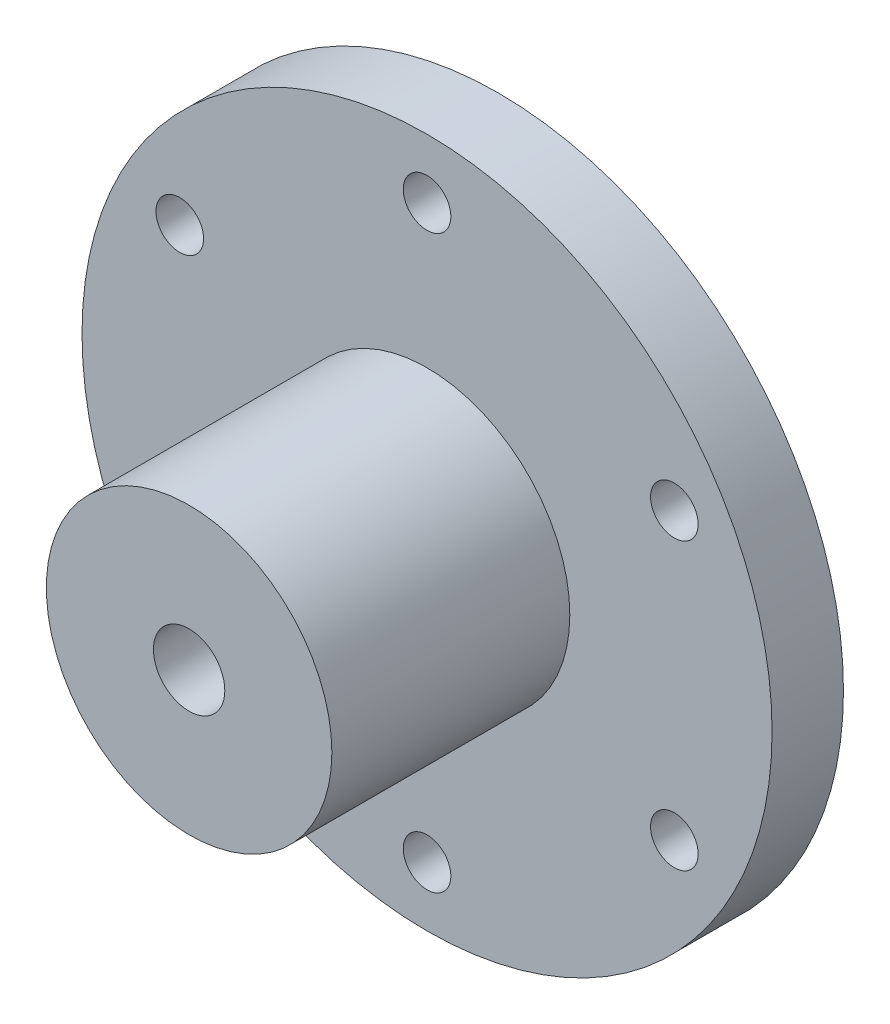
ISO-10303-21;
HEADER;
FILE_DESCRIPTION(('STEP AP214'),'2;1');
FILE_NAME('part.step','',(''),(''),'','','');
FILE_SCHEMA(('AUTOMOTIVE_DESIGN { 1 0 10303 214 1 1 1 1 }'));
ENDSEC;
DATA;
#1=APPLICATION_CONTEXT('core data for automotive mechanical design processes');
#2=APPLICATION_PROTOCOL_DEFINITION('international standard','automotive_design',2000,#1);
#3=PRODUCT_CONTEXT('',#1,'mechanical');
#4=PRODUCT('Part','Part','',(#3));
#5=PRODUCT_RELATED_PRODUCT_CATEGORY('part','',(#4));
#6=PRODUCT_DEFINITION_FORMATION('','',#4);
#7=PRODUCT_DEFINITION_CONTEXT('part definition',#1,'design');
#8=PRODUCT_DEFINITION('design','',#6,#7);
#9=PRODUCT_DEFINITION_SHAPE('','',#8);
#10=(LENGTH_UNIT() NAMED_UNIT(*) SI_UNIT(.MILLI.,.METRE.));
#11=(NAMED_UNIT(*) PLANE_ANGLE_UNIT() SI_UNIT($,.RADIAN.));
#12=(NAMED_UNIT(*) SI_UNIT($,.STERADIAN.) SOLID_ANGLE_UNIT());
#13=UNCERTAINTY_MEASURE_WITH_UNIT(LENGTH_MEASURE(1.E-05),#10,'distance_accuracy_value','');
#14=(GEOMETRIC_REPRESENTATION_CONTEXT(3) GLOBAL_UNCERTAINTY_ASSIGNED_CONTEXT((#13)) GLOBAL_UNIT_ASSIGNED_CONTEXT((#10,
#11,#12)) REPRESENTATION_CONTEXT('',''));
#15=CARTESIAN_POINT('',(0.,0.,0.));
#16=DIRECTION('',(0.,0.,1.));
#17=DIRECTION('',(1.,0.,0.));
#18=AXIS2_PLACEMENT_3D('',#15,#16,#17);
#19=CARTESIAN_POINT('',(0.,0.,6.));
#20=DIRECTION('',(0.,0.,-1.));
#21=DIRECTION('',(-1.,0.,0.));
#22=AXIS2_PLACEMENT_3D('',#19,#20,#21);
#23=CYLINDRICAL_SURFACE('',#22,29.);
#24=CARTESIAN_POINT('',(0.,0.,6.));
#25=DIRECTION('',(0.,0.,1.));
#26=DIRECTION('',(1.,0.,0.));
#27=AXIS2_PLACEMENT_3D('',#24,#25,#26);
#28=CIRCLE('',#27,29.);
#29=CARTESIAN_POINT('',(29.,0.,6.));
#30=VERTEX_POINT('',#29);
#31=EDGE_CURVE('E10',#30,#30,#28,.T.);
#32=ORIENTED_EDGE('',*,*,#31,.F.);
#33=EDGE_LOOP('',(#32));
#34=FACE_BOUND('',#33,.T.);
#35=CARTESIAN_POINT('',(0.,0.,0.));
#36=DIRECTION('',(0.,0.,1.));
#37=DIRECTION('',(1.,0.,0.));
#38=AXIS2_PLACEMENT_3D('',#35,#36,#37);
#39=CIRCLE('',#38,29.);
#40=CARTESIAN_POINT('',(29.,0.,0.));
#41=VERTEX_POINT('',#40);
#42=EDGE_CURVE('E39',#41,#41,#39,.T.);
#43=ORIENTED_EDGE('',*,*,#42,.T.);
#44=EDGE_LOOP('',(#43));
#45=FACE_BOUND('',#44,.T.);
#46=ADVANCED_FACE('F32',(#34,#45),#23,.T.);
#47=CARTESIAN_POINT('',(0.,0.,6.));
#48=DIRECTION('',(0.,0.,1.));
#49=DIRECTION('',(1.,0.,0.));
#50=AXIS2_PLACEMENT_3D('',#47,#48,#49);
#51=PLANE('',#50);
#52=CARTESIAN_POINT('',(20.784609690827,12.0000000000009,6.));
#53=DIRECTION('',(0.,0.,1.));
#54=DIRECTION('',(1.,0.,0.));
#55=AXIS2_PLACEMENT_3D('',#52,#53,#54);
#56=CIRCLE('',#55,2.00000000000029);
#57=CARTESIAN_POINT('',(22.7846096908273,12.0000000000009,6.));
#58=VERTEX_POINT('',#57);
#59=EDGE_CURVE('E58',#58,#58,#56,.T.);
#60=ORIENTED_EDGE('',*,*,#59,.F.);
#61=EDGE_LOOP('',(#60));
#62=FACE_BOUND('',#61,.T.);
#63=CARTESIAN_POINT('',(20.7846096908281,-11.9999999999991,6.));
#64=DIRECTION('',(0.,0.,1.));
#65=DIRECTION('',(1.,0.,0.));
#66=AXIS2_PLACEMENT_3D('',#63,#64,#65);
#67=CIRCLE('',#66,2.00000000000132);
#68=CARTESIAN_POINT('',(22.7846096908294,-11.9999999999991,6.));
#69=VERTEX_POINT('',#68);
#70=EDGE_CURVE('E148',#69,#69,#67,.T.);
#71=ORIENTED_EDGE('',*,*,#70,.F.);
#72=EDGE_LOOP('',(#71));
#73=FACE_BOUND('',#72,.T.);
#74=CARTESIAN_POINT('',(2.04048477435318E-12,-24.,6.));
#75=DIRECTION('',(0.,0.,1.));
#76=DIRECTION('',(1.,0.,0.));
#77=AXIS2_PLACEMENT_3D('',#74,#75,#76);
#78=CIRCLE('',#77,2.00000000000211);
#79=CARTESIAN_POINT('',(2.00000000000415,-24.,6.));
#80=VERTEX_POINT('',#79);
#81=EDGE_CURVE('E151',#80,#80,#78,.T.);
#82=ORIENTED_EDGE('',*,*,#81,.F.);
#83=EDGE_LOOP('',(#82));
#84=FACE_BOUND('',#83,.T.);
#85=CARTESIAN_POINT('',(-20.784609690825,-12.0000000000009,6.));
#86=DIRECTION('',(0.,0.,1.));
#87=DIRECTION('',(1.,0.,0.));
#88=AXIS2_PLACEMENT_3D('',#85,#86,#87);
#89=CIRCLE('',#88,2.00000000000194);
#90=CARTESIAN_POINT('',(-18.7846096908231,-12.0000000000009,6.));
#91=VERTEX_POINT('',#90);
#92=EDGE_CURVE('E143',#91,#91,#89,.T.);
#93=ORIENTED_EDGE('',*,*,#92,.F.);
#94=EDGE_LOOP('',(#93));
#95=FACE_BOUND('',#94,.T.);
#96=CARTESIAN_POINT('',(-20.784609690826,11.9999999999991,6.));
#97=DIRECTION('',(0.,0.,1.));
#98=DIRECTION('',(1.,0.,0.));
#99=AXIS2_PLACEMENT_3D('',#96,#97,#98);
#100=CIRCLE('',#99,2.00000000000103);
#101=CARTESIAN_POINT('',(-18.784609690825,11.9999999999991,6.));
#102=VERTEX_POINT('',#101);
#103=EDGE_CURVE('E75',#102,#102,#100,.T.);
#104=ORIENTED_EDGE('',*,*,#103,.F.);
#105=EDGE_LOOP('',(#104));
#106=FACE_BOUND('',#105,.T.);
#107=CARTESIAN_POINT('',(0.,24.,6.));
#108=DIRECTION('',(0.,0.,1.));
#109=DIRECTION('',(1.,0.,0.));
#110=AXIS2_PLACEMENT_3D('',#107,#108,#109);
#111=CIRCLE('',#110,2.);
#112=CARTESIAN_POINT('',(2.,24.,6.));
#113=VERTEX_POINT('',#112);
#114=EDGE_CURVE('E53',#113,#113,#111,.T.);
#115=ORIENTED_EDGE('',*,*,#114,.F.);
#116=EDGE_LOOP('',(#115));
#117=FACE_BOUND('',#116,.T.);
#118=CARTESIAN_POINT('',(0.,0.,6.));
#119=DIRECTION('',(0.,0.,1.));
#120=DIRECTION('',(1.,0.,0.));
#121=AXIS2_PLACEMENT_3D('',#118,#119,#120);
#122=CIRCLE('',#121,12.);
#123=CARTESIAN_POINT('',(12.,0.,6.));
#124=VERTEX_POINT('',#123);
#125=EDGE_CURVE('E47',#124,#124,#122,.T.);
#126=ORIENTED_EDGE('',*,*,#125,.F.);
#127=EDGE_LOOP('',(#126));
#128=FACE_BOUND('',#127,.T.);
#129=ORIENTED_EDGE('',*,*,#31,.T.);
#130=EDGE_LOOP('',(#129));
#131=FACE_BOUND('',#130,.T.);
#132=ADVANCED_FACE('F85',(#62,#73,#84,#95,#106,#117,#128,#131),#51,.T.);
#133=CARTESIAN_POINT('',(0.,0.,0.));
#134=DIRECTION('',(0.,0.,1.));
#135=DIRECTION('',(1.,0.,0.));
#136=AXIS2_PLACEMENT_3D('',#133,#134,#135);
#137=PLANE('',#136);
#138=CARTESIAN_POINT('',(0.,0.,0.));
#139=DIRECTION('',(0.,0.,1.));
#140=DIRECTION('',(1.,0.,0.));
#141=AXIS2_PLACEMENT_3D('',#138,#139,#140);
#142=CIRCLE('',#141,3.);
#143=CARTESIAN_POINT('',(3.,0.,0.));
#144=VERTEX_POINT('',#143);
#145=EDGE_CURVE('E140',#144,#144,#142,.T.);
#146=ORIENTED_EDGE('',*,*,#145,.T.);
#147=EDGE_LOOP('',(#146));
#148=FACE_BOUND('',#147,.T.);
#149=CARTESIAN_POINT('',(20.784609690827,12.0000000000009,0.));
#150=DIRECTION('',(0.,0.,1.));
#151=DIRECTION('',(1.,0.,0.));
#152=AXIS2_PLACEMENT_3D('',#149,#150,#151);
#153=CIRCLE('',#152,2.00000000000029);
#154=CARTESIAN_POINT('',(22.7846096908273,12.0000000000009,0.));
#155=VERTEX_POINT('',#154);
#156=EDGE_CURVE('E35',#155,#155,#153,.T.);
#157=ORIENTED_EDGE('',*,*,#156,.T.);
#158=EDGE_LOOP('',(#157));
#159=FACE_BOUND('',#158,.T.);
#160=CARTESIAN_POINT('',(20.7846096908281,-11.9999999999991,0.));
#161=DIRECTION('',(0.,0.,1.));
#162=DIRECTION('',(1.,0.,0.));
#163=AXIS2_PLACEMENT_3D('',#160,#161,#162);
#164=CIRCLE('',#163,2.00000000000132);
#165=CARTESIAN_POINT('',(22.7846096908294,-11.9999999999991,0.));
#166=VERTEX_POINT('',#165);
#167=EDGE_CURVE('E63',#166,#166,#164,.T.);
#168=ORIENTED_EDGE('',*,*,#167,.T.);
#169=EDGE_LOOP('',(#168));
#170=FACE_BOUND('',#169,.T.);
#171=CARTESIAN_POINT('',(2.04048477435318E-12,-24.,0.));
#172=DIRECTION('',(0.,0.,1.));
#173=DIRECTION('',(1.,0.,0.));
#174=AXIS2_PLACEMENT_3D('',#171,#172,#173);
#175=CIRCLE('',#174,2.00000000000211);
#176=CARTESIAN_POINT('',(2.00000000000415,-24.,0.));
#177=VERTEX_POINT('',#176);
#178=EDGE_CURVE('E61',#177,#177,#175,.T.);
#179=ORIENTED_EDGE('',*,*,#178,.T.);
#180=EDGE_LOOP('',(#179));
#181=FACE_BOUND('',#180,.T.);
#182=CARTESIAN_POINT('',(-20.784609690825,-12.0000000000009,0.));
#183=DIRECTION('',(0.,0.,1.));
#184=DIRECTION('',(1.,0.,0.));
#185=AXIS2_PLACEMENT_3D('',#182,#183,#184);
#186=CIRCLE('',#185,2.00000000000194);
#187=CARTESIAN_POINT('',(-18.7846096908231,-12.0000000000009,0.));
#188=VERTEX_POINT('',#187);
#189=EDGE_CURVE('E57',#188,#188,#186,.T.);
#190=ORIENTED_EDGE('',*,*,#189,.T.);
#191=EDGE_LOOP('',(#190));
#192=FACE_BOUND('',#191,.T.);
#193=CARTESIAN_POINT('',(-20.784609690826,11.9999999999991,0.));
#194=DIRECTION('',(0.,0.,1.));
#195=DIRECTION('',(1.,0.,0.));
#196=AXIS2_PLACEMENT_3D('',#193,#194,#195);
#197=CIRCLE('',#196,2.00000000000103);
#198=CARTESIAN_POINT('',(-18.784609690825,11.9999999999991,0.));
#199=VERTEX_POINT('',#198);
#200=EDGE_CURVE('E54',#199,#199,#197,.T.);
#201=ORIENTED_EDGE('',*,*,#200,.T.);
#202=EDGE_LOOP('',(#201));
#203=FACE_BOUND('',#202,.T.);
#204=CARTESIAN_POINT('',(0.,24.,0.));
#205=DIRECTION('',(0.,0.,1.));
#206=DIRECTION('',(1.,0.,0.));
#207=AXIS2_PLACEMENT_3D('',#204,#205,#206);
#208=CIRCLE('',#207,2.);
#209=CARTESIAN_POINT('',(2.,24.,0.));
#210=VERTEX_POINT('',#209);
#211=EDGE_CURVE('E50',#210,#210,#208,.T.);
#212=ORIENTED_EDGE('',*,*,#211,.T.);
#213=EDGE_LOOP('',(#212));
#214=FACE_BOUND('',#213,.T.);
#215=ORIENTED_EDGE('',*,*,#42,.F.);
#216=EDGE_LOOP('',(#215));
#217=FACE_BOUND('',#216,.T.);
#218=ADVANCED_FACE('F87',(#148,#159,#170,#181,#192,#203,#214,#217),#137,.F.);
#219=CARTESIAN_POINT('',(0.,0.,26.));
#220=DIRECTION('',(0.,0.,-1.));
#221=DIRECTION('',(-1.,0.,0.));
#222=AXIS2_PLACEMENT_3D('',#219,#220,#221);
#223=CYLINDRICAL_SURFACE('',#222,12.);
#224=CARTESIAN_POINT('',(0.,0.,26.));
#225=DIRECTION('',(0.,0.,1.));
#226=DIRECTION('',(1.,0.,0.));
#227=AXIS2_PLACEMENT_3D('',#224,#225,#226);
#228=CIRCLE('',#227,12.);
#229=CARTESIAN_POINT('',(12.,0.,26.));
#230=VERTEX_POINT('',#229);
#231=EDGE_CURVE('E44',#230,#230,#228,.T.);
#232=ORIENTED_EDGE('',*,*,#231,.F.);
#233=EDGE_LOOP('',(#232));
#234=FACE_BOUND('',#233,.T.);
#235=ORIENTED_EDGE('',*,*,#125,.T.);
#236=EDGE_LOOP('',(#235));
#237=FACE_BOUND('',#236,.T.);
#238=ADVANCED_FACE('F83',(#234,#237),#223,.T.);
#239=CARTESIAN_POINT('',(0.,0.,26.));
#240=DIRECTION('',(0.,0.,1.));
#241=DIRECTION('',(1.,0.,0.));
#242=AXIS2_PLACEMENT_3D('',#239,#240,#241);
#243=PLANE('',#242);
#244=CARTESIAN_POINT('',(0.,0.,26.));
#245=DIRECTION('',(0.,0.,1.));
#246=DIRECTION('',(1.,0.,0.));
#247=AXIS2_PLACEMENT_3D('',#244,#245,#246);
#248=CIRCLE('',#247,3.);
#249=CARTESIAN_POINT('',(3.,0.,26.));
#250=VERTEX_POINT('',#249);
#251=EDGE_CURVE('E137',#250,#250,#248,.T.);
#252=ORIENTED_EDGE('',*,*,#251,.F.);
#253=EDGE_LOOP('',(#252));
#254=FACE_BOUND('',#253,.T.);
#255=ORIENTED_EDGE('',*,*,#231,.T.);
#256=EDGE_LOOP('',(#255));
#257=FACE_BOUND('',#256,.T.);
#258=ADVANCED_FACE('F101',(#254,#257),#243,.T.);
#259=CARTESIAN_POINT('',(0.,24.,-4.));
#260=DIRECTION('',(0.,0.,1.));
#261=DIRECTION('',(1.,0.,0.));
#262=AXIS2_PLACEMENT_3D('',#259,#260,#261);
#263=CYLINDRICAL_SURFACE('',#262,2.);
#264=ORIENTED_EDGE('',*,*,#114,.T.);
#265=EDGE_LOOP('',(#264));
#266=FACE_BOUND('',#265,.T.);
#267=ORIENTED_EDGE('',*,*,#211,.F.);
#268=EDGE_LOOP('',(#267));
#269=FACE_BOUND('',#268,.T.);
#270=ADVANCED_FACE('F105',(#266,#269),#263,.F.);
#271=CARTESIAN_POINT('',(-20.784609690826,11.9999999999991,-4.));
#272=DIRECTION('',(0.,0.,1.));
#273=DIRECTION('',(1.,0.,0.));
#274=AXIS2_PLACEMENT_3D('',#271,#272,#273);
#275=CYLINDRICAL_SURFACE('',#274,2.00000000000103);
#276=ORIENTED_EDGE('',*,*,#103,.T.);
#277=EDGE_LOOP('',(#276));
#278=FACE_BOUND('',#277,.T.);
#279=ORIENTED_EDGE('',*,*,#200,.F.);
#280=EDGE_LOOP('',(#279));
#281=FACE_BOUND('',#280,.T.);
#282=ADVANCED_FACE('F109',(#278,#281),#275,.F.);
#283=CARTESIAN_POINT('',(-20.784609690825,-12.0000000000009,-4.));
#284=DIRECTION('',(0.,0.,1.));
#285=DIRECTION('',(1.,0.,0.));
#286=AXIS2_PLACEMENT_3D('',#283,#284,#285);
#287=CYLINDRICAL_SURFACE('',#286,2.00000000000194);
#288=ORIENTED_EDGE('',*,*,#92,.T.);
#289=EDGE_LOOP('',(#288));
#290=FACE_BOUND('',#289,.T.);
#291=ORIENTED_EDGE('',*,*,#189,.F.);
#292=EDGE_LOOP('',(#291));
#293=FACE_BOUND('',#292,.T.);
#294=ADVANCED_FACE('F112',(#290,#293),#287,.F.);
#295=CARTESIAN_POINT('',(2.04048477435318E-12,-24.,-4.));
#296=DIRECTION('',(0.,0.,1.));
#297=DIRECTION('',(1.,0.,0.));
#298=AXIS2_PLACEMENT_3D('',#295,#296,#297);
#299=CYLINDRICAL_SURFACE('',#298,2.00000000000211);
#300=ORIENTED_EDGE('',*,*,#81,.T.);
#301=EDGE_LOOP('',(#300));
#302=FACE_BOUND('',#301,.T.);
#303=ORIENTED_EDGE('',*,*,#178,.F.);
#304=EDGE_LOOP('',(#303));
#305=FACE_BOUND('',#304,.T.);
#306=ADVANCED_FACE('F116',(#302,#305),#299,.F.);
#307=CARTESIAN_POINT('',(20.7846096908281,-11.9999999999991,-4.));
#308=DIRECTION('',(0.,0.,1.));
#309=DIRECTION('',(1.,0.,0.));
#310=AXIS2_PLACEMENT_3D('',#307,#308,#309);
#311=CYLINDRICAL_SURFACE('',#310,2.00000000000132);
#312=ORIENTED_EDGE('',*,*,#70,.T.);
#313=EDGE_LOOP('',(#312));
#314=FACE_BOUND('',#313,.T.);
#315=ORIENTED_EDGE('',*,*,#167,.F.);
#316=EDGE_LOOP('',(#315));
#317=FACE_BOUND('',#316,.T.);
#318=ADVANCED_FACE('F120',(#314,#317),#311,.F.);
#319=CARTESIAN_POINT('',(20.784609690827,12.0000000000009,-4.));
#320=DIRECTION('',(0.,0.,1.));
#321=DIRECTION('',(1.,0.,0.));
#322=AXIS2_PLACEMENT_3D('',#319,#320,#321);
#323=CYLINDRICAL_SURFACE('',#322,2.00000000000029);
#324=ORIENTED_EDGE('',*,*,#59,.T.);
#325=EDGE_LOOP('',(#324));
#326=FACE_BOUND('',#325,.T.);
#327=ORIENTED_EDGE('',*,*,#156,.F.);
#328=EDGE_LOOP('',(#327));
#329=FACE_BOUND('',#328,.T.);
#330=ADVANCED_FACE('F124',(#326,#329),#323,.F.);
#331=CARTESIAN_POINT('',(0.,0.,-4.));
#332=DIRECTION('',(0.,0.,1.));
#333=DIRECTION('',(1.,0.,0.));
#334=AXIS2_PLACEMENT_3D('',#331,#332,#333);
#335=CYLINDRICAL_SURFACE('',#334,3.);
#336=ORIENTED_EDGE('',*,*,#251,.T.);
#337=EDGE_LOOP('',(#336));
#338=FACE_BOUND('',#337,.T.);
#339=ORIENTED_EDGE('',*,*,#145,.F.);
#340=EDGE_LOOP('',(#339));
#341=FACE_BOUND('',#340,.T.);
#342=ADVANCED_FACE('F128',(#338,#341),#335,.F.);
#343=CLOSED_SHELL('',(#46,#132,#218,#238,#258,#270,#282,#294,#306,#318,#330,#342));
#344=MANIFOLD_SOLID_BREP('B2',#343);
#345=ADVANCED_BREP_SHAPE_REPRESENTATION('',(#18,#344),#14);
#346=SHAPE_DEFINITION_REPRESENTATION(#9,#345);
ENDSEC;
END-ISO-10303-21;
